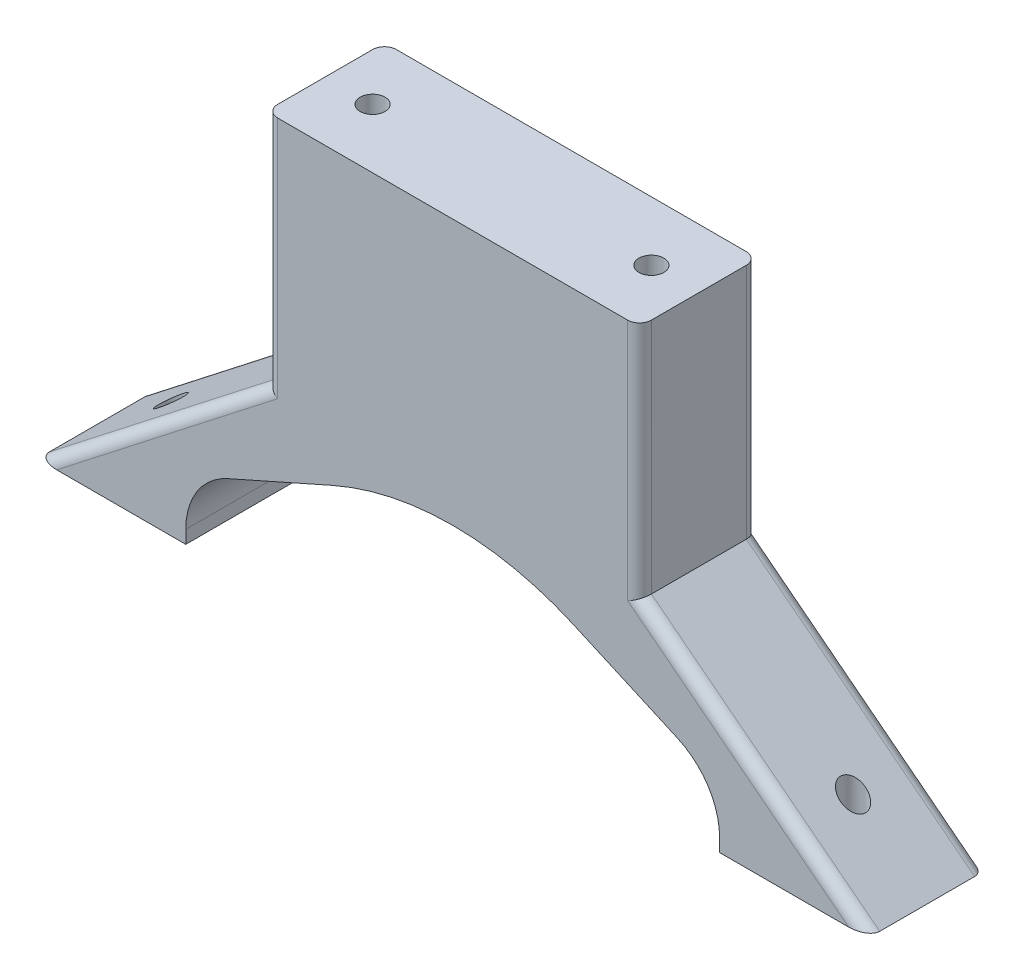
ISO-10303-21;
HEADER;
FILE_DESCRIPTION(('STEP AP214'),'2;1');
FILE_NAME('part.step','',(''),(''),'','','');
FILE_SCHEMA(('AUTOMOTIVE_DESIGN { 1 0 10303 214 1 1 1 1 }'));
ENDSEC;
DATA;
#1=APPLICATION_CONTEXT('core data for automotive mechanical design processes');
#2=APPLICATION_PROTOCOL_DEFINITION('international standard','automotive_design',2000,#1);
#3=PRODUCT_CONTEXT('',#1,'mechanical');
#4=PRODUCT('Part','Part','',(#3));
#5=PRODUCT_RELATED_PRODUCT_CATEGORY('part','',(#4));
#6=PRODUCT_DEFINITION_FORMATION('','',#4);
#7=PRODUCT_DEFINITION_CONTEXT('part definition',#1,'design');
#8=PRODUCT_DEFINITION('design','',#6,#7);
#9=PRODUCT_DEFINITION_SHAPE('','',#8);
#10=(LENGTH_UNIT() NAMED_UNIT(*) SI_UNIT(.MILLI.,.METRE.));
#11=(NAMED_UNIT(*) PLANE_ANGLE_UNIT() SI_UNIT($,.RADIAN.));
#12=(NAMED_UNIT(*) SI_UNIT($,.STERADIAN.) SOLID_ANGLE_UNIT());
#13=UNCERTAINTY_MEASURE_WITH_UNIT(LENGTH_MEASURE(1.E-05),#10,'distance_accuracy_value','');
#14=(GEOMETRIC_REPRESENTATION_CONTEXT(3) GLOBAL_UNCERTAINTY_ASSIGNED_CONTEXT((#13)) GLOBAL_UNIT_ASSIGNED_CONTEXT((#10,
#11,#12)) REPRESENTATION_CONTEXT('',''));
#15=CARTESIAN_POINT('',(0.,0.,0.));
#16=DIRECTION('',(0.,0.,1.));
#17=DIRECTION('',(1.,0.,0.));
#18=AXIS2_PLACEMENT_3D('',#15,#16,#17);
#19=CARTESIAN_POINT('',(0.,0.,-20.));
#20=DIRECTION('',(-1.,0.,0.));
#21=DIRECTION('',(0.,-1.,0.));
#22=AXIS2_PLACEMENT_3D('',#19,#20,#21);
#23=PLANE('',#22);
#24=DIRECTION('',(0.,0.,1.));
#25=VECTOR('',#24,1.);
#26=CARTESIAN_POINT('',(0.,-3.53209388071521,-20.));
#27=LINE('',#26,#25);
#28=CARTESIAN_POINT('',(0.,-3.53209388071521,-18.));
#29=VERTEX_POINT('',#28);
#30=CARTESIAN_POINT('',(0.,-3.53209388071521,-2.));
#31=VERTEX_POINT('',#30);
#32=EDGE_CURVE('E232',#29,#31,#27,.T.);
#33=ORIENTED_EDGE('',*,*,#32,.F.);
#34=DIRECTION('',(0.,-1.,0.));
#35=VECTOR('',#34,1.);
#36=CARTESIAN_POINT('',(0.,-43.5320938807152,-18.));
#37=LINE('',#36,#35);
#38=CARTESIAN_POINT('',(0.,-43.5320938807152,-18.));
#39=VERTEX_POINT('',#38);
#40=EDGE_CURVE('E305',#29,#39,#37,.T.);
#41=ORIENTED_EDGE('',*,*,#40,.T.);
#42=DIRECTION('',(0.,0.,1.));
#43=VECTOR('',#42,1.);
#44=CARTESIAN_POINT('',(0.,-43.5320938807152,-20.));
#45=LINE('',#44,#43);
#46=CARTESIAN_POINT('',(0.,-43.5320938807152,-2.));
#47=VERTEX_POINT('',#46);
#48=EDGE_CURVE('E213',#39,#47,#45,.T.);
#49=ORIENTED_EDGE('',*,*,#48,.T.);
#50=DIRECTION('',(0.,-1.,0.));
#51=VECTOR('',#50,1.);
#52=CARTESIAN_POINT('',(0.,0.,-2.));
#53=LINE('',#52,#51);
#54=EDGE_CURVE('E303',#47,#31,#53,.F.);
#55=ORIENTED_EDGE('',*,*,#54,.T.);
#56=EDGE_LOOP('',(#33,#41,#49,#55));
#57=FACE_BOUND('',#56,.T.);
#58=ADVANCED_FACE('F35',(#57),#23,.T.);
#59=CARTESIAN_POINT('',(0.,-3.53209388071521,-20.));
#60=DIRECTION('',(0.,-1.,0.));
#61=DIRECTION('',(1.,0.,0.));
#62=AXIS2_PLACEMENT_3D('',#59,#60,#61);
#63=PLANE('',#62);
#64=CARTESIAN_POINT('',(8.,-3.53209388071521,-10.));
#65=DIRECTION('',(0.,1.,0.));
#66=DIRECTION('',(0.,0.,1.));
#67=AXIS2_PLACEMENT_3D('',#64,#65,#66);
#68=CIRCLE('',#67,2.09999999999999);
#69=CARTESIAN_POINT('',(8.,-3.53209388071521,-7.90000000000001));
#70=VERTEX_POINT('',#69);
#71=EDGE_CURVE('E671',#70,#70,#68,.T.);
#72=ORIENTED_EDGE('',*,*,#71,.F.);
#73=EDGE_LOOP('',(#72));
#74=FACE_BOUND('',#73,.T.);
#75=CARTESIAN_POINT('',(55.,-3.53209388071521,-10.));
#76=DIRECTION('',(0.,1.,0.));
#77=DIRECTION('',(0.,0.,1.));
#78=AXIS2_PLACEMENT_3D('',#75,#76,#77);
#79=CIRCLE('',#78,2.09999999999998);
#80=CARTESIAN_POINT('',(55.,-3.53209388071521,-7.90000000000002));
#81=VERTEX_POINT('',#80);
#82=EDGE_CURVE('E665',#81,#81,#79,.T.);
#83=ORIENTED_EDGE('',*,*,#82,.F.);
#84=EDGE_LOOP('',(#83));
#85=FACE_BOUND('',#84,.T.);
#86=DIRECTION('',(0.,0.,1.));
#87=VECTOR('',#86,1.);
#88=CARTESIAN_POINT('',(63.,-3.53209388071522,-20.));
#89=LINE('',#88,#87);
#90=CARTESIAN_POINT('',(63.,-3.53209388071522,-18.));
#91=VERTEX_POINT('',#90);
#92=CARTESIAN_POINT('',(63.,-3.53209388071522,-2.));
#93=VERTEX_POINT('',#92);
#94=EDGE_CURVE('E236',#91,#93,#89,.T.);
#95=ORIENTED_EDGE('',*,*,#94,.F.);
#96=CARTESIAN_POINT('',(61.,-3.53209388071522,-18.));
#97=DIRECTION('',(0.,-1.,0.));
#98=DIRECTION('',(1.,0.,0.));
#99=AXIS2_PLACEMENT_3D('',#96,#97,#98);
#100=CIRCLE('',#99,2.);
#101=CARTESIAN_POINT('',(61.,-3.53209388071522,-20.));
#102=VERTEX_POINT('',#101);
#103=EDGE_CURVE('E301',#91,#102,#100,.F.);
#104=ORIENTED_EDGE('',*,*,#103,.T.);
#105=DIRECTION('',(1.,0.,0.));
#106=VECTOR('',#105,1.);
#107=CARTESIAN_POINT('',(0.,-3.53209388071521,-20.));
#108=LINE('',#107,#106);
#109=CARTESIAN_POINT('',(2.,-3.53209388071521,-20.));
#110=VERTEX_POINT('',#109);
#111=EDGE_CURVE('E210',#110,#102,#108,.T.);
#112=ORIENTED_EDGE('',*,*,#111,.F.);
#113=CARTESIAN_POINT('',(2.,-3.53209388071521,-18.));
#114=DIRECTION('',(0.,-1.,0.));
#115=DIRECTION('',(1.,0.,0.));
#116=AXIS2_PLACEMENT_3D('',#113,#114,#115);
#117=CIRCLE('',#116,2.);
#118=EDGE_CURVE('E297',#110,#29,#117,.F.);
#119=ORIENTED_EDGE('',*,*,#118,.T.);
#120=ORIENTED_EDGE('',*,*,#32,.T.);
#121=CARTESIAN_POINT('',(2.,-3.53209388071521,-2.));
#122=DIRECTION('',(0.,-1.,0.));
#123=DIRECTION('',(1.,0.,0.));
#124=AXIS2_PLACEMENT_3D('',#121,#122,#123);
#125=CIRCLE('',#124,2.);
#126=CARTESIAN_POINT('',(2.,-3.53209388071521,0.));
#127=VERTEX_POINT('',#126);
#128=EDGE_CURVE('E295',#31,#127,#125,.F.);
#129=ORIENTED_EDGE('',*,*,#128,.T.);
#130=DIRECTION('',(1.,0.,0.));
#131=VECTOR('',#130,1.);
#132=CARTESIAN_POINT('',(0.,-3.53209388071521,0.));
#133=LINE('',#132,#131);
#134=CARTESIAN_POINT('',(61.,-3.53209388071522,0.));
#135=VERTEX_POINT('',#134);
#136=EDGE_CURVE('E182',#127,#135,#133,.T.);
#137=ORIENTED_EDGE('',*,*,#136,.T.);
#138=CARTESIAN_POINT('',(61.,-3.53209388071522,-2.));
#139=DIRECTION('',(0.,-1.,0.));
#140=DIRECTION('',(1.,0.,0.));
#141=AXIS2_PLACEMENT_3D('',#138,#139,#140);
#142=CIRCLE('',#141,2.);
#143=EDGE_CURVE('E299',#135,#93,#142,.F.);
#144=ORIENTED_EDGE('',*,*,#143,.T.);
#145=EDGE_LOOP('',(#95,#104,#112,#119,#120,#129,#137,#144));
#146=FACE_BOUND('',#145,.T.);
#147=ADVANCED_FACE('F368',(#74,#85,#146),#63,.F.);
#148=CARTESIAN_POINT('',(63.,0.,-20.));
#149=DIRECTION('',(-1.,0.,0.));
#150=DIRECTION('',(0.,0.,1.));
#151=AXIS2_PLACEMENT_3D('',#148,#149,#150);
#152=PLANE('',#151);
#153=DIRECTION('',(0.,0.,1.));
#154=VECTOR('',#153,1.);
#155=CARTESIAN_POINT('',(63.,-43.5320938807152,-20.));
#156=LINE('',#155,#154);
#157=CARTESIAN_POINT('',(63.,-43.5320938807152,-18.));
#158=VERTEX_POINT('',#157);
#159=CARTESIAN_POINT('',(63.,-43.5320938807152,-2.));
#160=VERTEX_POINT('',#159);
#161=EDGE_CURVE('E239',#158,#160,#156,.T.);
#162=ORIENTED_EDGE('',*,*,#161,.F.);
#163=DIRECTION('',(0.,-1.,0.));
#164=VECTOR('',#163,1.);
#165=CARTESIAN_POINT('',(63.,0.,-18.));
#166=LINE('',#165,#164);
#167=EDGE_CURVE('E293',#158,#91,#166,.F.);
#168=ORIENTED_EDGE('',*,*,#167,.T.);
#169=ORIENTED_EDGE('',*,*,#94,.T.);
#170=DIRECTION('',(0.,-1.,0.));
#171=VECTOR('',#170,1.);
#172=CARTESIAN_POINT('',(63.,-43.5320938807152,-2.));
#173=LINE('',#172,#171);
#174=EDGE_CURVE('E291',#93,#160,#173,.T.);
#175=ORIENTED_EDGE('',*,*,#174,.T.);
#176=EDGE_LOOP('',(#162,#168,#169,#175));
#177=FACE_BOUND('',#176,.T.);
#178=ADVANCED_FACE('F401',(#177),#152,.F.);
#179=CARTESIAN_POINT('',(2.69511242219498,3.45872760848355,-20.));
#180=DIRECTION('',(-0.614649576762478,-0.788800290178513,0.));
#181=DIRECTION('',(0.788800290178513,-0.614649576762478,0.));
#182=AXIS2_PLACEMENT_3D('',#179,#180,#181);
#183=PLANE('',#182);
#184=CARTESIAN_POINT('',(89.0000000000036,-63.7918341404582,-10.));
#185=DIRECTION('',(-0.614649576762478,-0.788800290178513,0.));
#186=DIRECTION('',(0.788800290178513,-0.614649576762478,0.));
#187=AXIS2_PLACEMENT_3D('',#184,#185,#186);
#188=ELLIPSE('',#187,2.66227082589529,2.1);
#189=CARTESIAN_POINT('',(91.1000000000035,-65.4281977768219,-10.));
#190=VERTEX_POINT('',#189);
#191=EDGE_CURVE('E216',#190,#190,#188,.T.);
#192=ORIENTED_EDGE('',*,*,#191,.T.);
#193=EDGE_LOOP('',(#192));
#194=FACE_BOUND('',#193,.T.);
#195=DIRECTION('',(0.,0.,1.));
#196=VECTOR('',#195,1.);
#197=CARTESIAN_POINT('',(101.5,-73.5320938807152,-20.));
#198=LINE('',#197,#196);
#199=CARTESIAN_POINT('',(101.5,-73.5320938807152,-18.));
#200=VERTEX_POINT('',#199);
#201=CARTESIAN_POINT('',(101.5,-73.5320938807152,-2.));
#202=VERTEX_POINT('',#201);
#203=EDGE_CURVE('E242',#200,#202,#198,.T.);
#204=ORIENTED_EDGE('',*,*,#203,.F.);
#205=DIRECTION('',(0.788800290178513,-0.614649576762478,0.));
#206=VECTOR('',#205,1.);
#207=CARTESIAN_POINT('',(2.69511242219498,3.45872760848355,-18.));
#208=LINE('',#207,#206);
#209=EDGE_CURVE('E272',#200,#158,#208,.F.);
#210=ORIENTED_EDGE('',*,*,#209,.T.);
#211=ORIENTED_EDGE('',*,*,#161,.T.);
#212=DIRECTION('',(0.788800290178513,-0.614649576762478,0.));
#213=VECTOR('',#212,1.);
#214=CARTESIAN_POINT('',(101.5,-73.5320938807152,-2.));
#215=LINE('',#214,#213);
#216=EDGE_CURVE('E269',#160,#202,#215,.T.);
#217=ORIENTED_EDGE('',*,*,#216,.T.);
#218=EDGE_LOOP('',(#204,#210,#211,#217));
#219=FACE_BOUND('',#218,.T.);
#220=ADVANCED_FACE('F606',(#194,#219),#183,.F.);
#221=CARTESIAN_POINT('',(0.,-73.5320938807151,-20.));
#222=DIRECTION('',(0.,1.,0.));
#223=DIRECTION('',(-1.,0.,0.));
#224=AXIS2_PLACEMENT_3D('',#221,#222,#223);
#225=PLANE('',#224);
#226=CARTESIAN_POINT('',(89.0000000000036,-73.5320938807152,-10.));
#227=DIRECTION('',(0.,-1.,0.));
#228=DIRECTION('',(0.,0.,-1.));
#229=AXIS2_PLACEMENT_3D('',#226,#227,#228);
#230=CIRCLE('',#229,2.1);
#231=CARTESIAN_POINT('',(89.0000000000036,-73.5320938807152,-12.1));
#232=VERTEX_POINT('',#231);
#233=EDGE_CURVE('E654',#232,#232,#230,.T.);
#234=ORIENTED_EDGE('',*,*,#233,.F.);
#235=EDGE_LOOP('',(#234));
#236=FACE_BOUND('',#235,.T.);
#237=DIRECTION('',(-1.,0.,0.));
#238=VECTOR('',#237,1.);
#239=CARTESIAN_POINT('',(0.,-73.5320938807151,-20.));
#240=LINE('',#239,#238);
#241=CARTESIAN_POINT('',(98.2461134350169,-73.5320938807152,-20.));
#242=VERTEX_POINT('',#241);
#243=CARTESIAN_POINT('',(76.5,-73.5320938807152,-20.));
#244=VERTEX_POINT('',#243);
#245=EDGE_CURVE('E208',#242,#244,#240,.T.);
#246=ORIENTED_EDGE('',*,*,#245,.F.);
#247=CARTESIAN_POINT('',(98.2461134350169,-73.5320938807152,-18.));
#248=DIRECTION('',(0.,1.,0.));
#249=DIRECTION('',(1.,0.,0.));
#250=AXIS2_PLACEMENT_3D('',#247,#248,#249);
#251=ELLIPSE('',#250,3.25388656498314,2.);
#252=EDGE_CURVE('E267',#242,#200,#251,.F.);
#253=ORIENTED_EDGE('',*,*,#252,.T.);
#254=ORIENTED_EDGE('',*,*,#203,.T.);
#255=CARTESIAN_POINT('',(98.2461134350169,-73.5320938807152,-2.));
#256=DIRECTION('',(0.,1.,0.));
#257=DIRECTION('',(-1.,0.,0.));
#258=AXIS2_PLACEMENT_3D('',#255,#256,#257);
#259=ELLIPSE('',#258,3.25388656498314,2.);
#260=CARTESIAN_POINT('',(98.2461134350169,-73.5320938807152,0.));
#261=VERTEX_POINT('',#260);
#262=EDGE_CURVE('E265',#202,#261,#259,.F.);
#263=ORIENTED_EDGE('',*,*,#262,.T.);
#264=DIRECTION('',(-1.,0.,0.));
#265=VECTOR('',#264,1.);
#266=CARTESIAN_POINT('',(0.,-73.5320938807151,0.));
#267=LINE('',#266,#265);
#268=CARTESIAN_POINT('',(76.5,-73.5320938807152,0.));
#269=VERTEX_POINT('',#268);
#270=EDGE_CURVE('E228',#261,#269,#267,.T.);
#271=ORIENTED_EDGE('',*,*,#270,.T.);
#272=DIRECTION('',(0.,0.,1.));
#273=VECTOR('',#272,1.);
#274=CARTESIAN_POINT('',(76.5,-73.5320938807152,-20.));
#275=LINE('',#274,#273);
#276=EDGE_CURVE('E245',#244,#269,#275,.T.);
#277=ORIENTED_EDGE('',*,*,#276,.F.);
#278=EDGE_LOOP('',(#246,#253,#254,#263,#271,#277));
#279=FACE_BOUND('',#278,.T.);
#280=ADVANCED_FACE('F353',(#236,#279),#225,.F.);
#281=CARTESIAN_POINT('',(76.5,0.,-20.));
#282=DIRECTION('',(1.,0.,0.));
#283=DIRECTION('',(0.,0.,-1.));
#284=AXIS2_PLACEMENT_3D('',#281,#282,#283);
#285=PLANE('',#284);
#286=DIRECTION('',(0.,1.,0.));
#287=VECTOR('',#286,1.);
#288=CARTESIAN_POINT('',(76.5,0.,0.));
#289=LINE('',#288,#287);
#290=CARTESIAN_POINT('',(76.5,-71.3267766383689,0.));
#291=VERTEX_POINT('',#290);
#292=EDGE_CURVE('E225',#269,#291,#289,.T.);
#293=ORIENTED_EDGE('',*,*,#292,.T.);
#294=DIRECTION('',(0.,0.,1.));
#295=VECTOR('',#294,1.);
#296=CARTESIAN_POINT('',(76.5,-71.3267766383689,-20.));
#297=LINE('',#296,#295);
#298=CARTESIAN_POINT('',(76.5,-71.3267766383689,-20.));
#299=VERTEX_POINT('',#298);
#300=EDGE_CURVE('E324',#291,#299,#297,.F.);
#301=ORIENTED_EDGE('',*,*,#300,.T.);
#302=DIRECTION('',(0.,1.,0.));
#303=VECTOR('',#302,1.);
#304=CARTESIAN_POINT('',(76.5,0.,-20.));
#305=LINE('',#304,#303);
#306=EDGE_CURVE('E205',#244,#299,#305,.T.);
#307=ORIENTED_EDGE('',*,*,#306,.F.);
#308=ORIENTED_EDGE('',*,*,#276,.T.);
#309=EDGE_LOOP('',(#293,#301,#307,#308));
#310=FACE_BOUND('',#309,.T.);
#311=ADVANCED_FACE('F349',(#310),#285,.F.);
#312=CARTESIAN_POINT('',(-10.9540262481049,-24.6170582571376,-20.));
#313=DIRECTION('',(0.406544774887309,0.913630858723493,0.));
#314=DIRECTION('',(-0.913630858723493,0.406544774887309,0.));
#315=AXIS2_PLACEMENT_3D('',#312,#313,#314);
#316=PLANE('',#315);
#317=CARTESIAN_POINT('',(55.,-53.9650870566578,-10.));
#318=DIRECTION('',(0.406544774887309,0.913630858723493,0.));
#319=DIRECTION('',(-0.913630858723493,0.406544774887309,0.));
#320=AXIS2_PLACEMENT_3D('',#317,#318,#319);
#321=ELLIPSE('',#320,2.29852131191591,2.09999999999998);
#322=CARTESIAN_POINT('',(52.9,-53.0306352273312,-10.));
#323=VERTEX_POINT('',#322);
#324=EDGE_CURVE('E321',#323,#323,#321,.T.);
#325=ORIENTED_EDGE('',*,*,#324,.T.);
#326=EDGE_LOOP('',(#325));
#327=FACE_BOUND('',#326,.T.);
#328=DIRECTION('',(-0.913630858723493,0.406544774887309,0.));
#329=VECTOR('',#328,1.);
#330=CARTESIAN_POINT('',(-10.9540262481049,-24.6170582571376,-20.));
#331=LINE('',#330,#329);
#332=CARTESIAN_POINT('',(69.3785372986477,-60.363206333687,-20.));
#333=VERTEX_POINT('',#332);
#334=CARTESIAN_POINT('',(51.8567951982637,-52.5664330200242,-20.));
#335=VERTEX_POINT('',#334);
#336=EDGE_CURVE('E203',#333,#335,#331,.T.);
#337=ORIENTED_EDGE('',*,*,#336,.F.);
#338=DIRECTION('',(0.,0.,1.));
#339=VECTOR('',#338,1.);
#340=CARTESIAN_POINT('',(69.3785372986477,-60.3632063336869,0.));
#341=LINE('',#340,#339);
#342=CARTESIAN_POINT('',(69.3785372986477,-60.363206333687,0.));
#343=VERTEX_POINT('',#342);
#344=EDGE_CURVE('E307',#333,#343,#341,.T.);
#345=ORIENTED_EDGE('',*,*,#344,.T.);
#346=DIRECTION('',(-0.913630858723493,0.406544774887309,0.));
#347=VECTOR('',#346,1.);
#348=CARTESIAN_POINT('',(-10.9540262481049,-24.6170582571376,0.));
#349=LINE('',#348,#347);
#350=CARTESIAN_POINT('',(51.8567951982637,-52.5664330200242,0.));
#351=VERTEX_POINT('',#350);
#352=EDGE_CURVE('E223',#343,#351,#349,.T.);
#353=ORIENTED_EDGE('',*,*,#352,.T.);
#354=DIRECTION('',(0.,0.,1.));
#355=VECTOR('',#354,1.);
#356=CARTESIAN_POINT('',(51.8567951982637,-52.5664330200242,-20.));
#357=LINE('',#356,#355);
#358=EDGE_CURVE('E248',#335,#351,#357,.T.);
#359=ORIENTED_EDGE('',*,*,#358,.F.);
#360=EDGE_LOOP('',(#337,#345,#353,#359));
#361=FACE_BOUND('',#360,.T.);
#362=ADVANCED_FACE('F340',(#327,#361),#316,.F.);
#363=CARTESIAN_POINT('',(31.5295564538981,-98.2479759561988,-20.));
#364=DIRECTION('',(0.,0.,1.));
#365=DIRECTION('',(1.,0.,0.));
#366=AXIS2_PLACEMENT_3D('',#363,#364,#365);
#367=CYLINDRICAL_SURFACE('',#366,50.);
#368=CARTESIAN_POINT('',(31.5295564538981,-98.2479759561988,0.));
#369=DIRECTION('',(0.,0.,1.));
#370=DIRECTION('',(1.,0.,0.));
#371=AXIS2_PLACEMENT_3D('',#368,#369,#370);
#372=CIRCLE('',#371,50.);
#373=CARTESIAN_POINT('',(11.2429120255452,-52.5483910802114,0.));
#374=VERTEX_POINT('',#373);
#375=EDGE_CURVE('E220',#351,#374,#372,.T.);
#376=ORIENTED_EDGE('',*,*,#375,.T.);
#377=DIRECTION('',(0.,0.,1.));
#378=VECTOR('',#377,1.);
#379=CARTESIAN_POINT('',(11.2429120255452,-52.5483910802114,-20.));
#380=LINE('',#379,#378);
#381=CARTESIAN_POINT('',(11.2429120255452,-52.5483910802114,-20.));
#382=VERTEX_POINT('',#381);
#383=EDGE_CURVE('E190',#382,#374,#380,.T.);
#384=ORIENTED_EDGE('',*,*,#383,.F.);
#385=CARTESIAN_POINT('',(31.5295564538981,-98.2479759561988,-20.));
#386=DIRECTION('',(0.,0.,1.));
#387=DIRECTION('',(1.,0.,0.));
#388=AXIS2_PLACEMENT_3D('',#385,#386,#387);
#389=CIRCLE('',#388,50.);
#390=EDGE_CURVE('E197',#335,#382,#389,.T.);
#391=ORIENTED_EDGE('',*,*,#390,.F.);
#392=ORIENTED_EDGE('',*,*,#358,.T.);
#393=EDGE_LOOP('',(#376,#384,#391,#392));
#394=FACE_BOUND('',#393,.T.);
#395=ADVANCED_FACE('F499',(#394),#367,.F.);
#396=CARTESIAN_POINT('',(21.337659908571,-48.0672002454908,-20.));
#397=DIRECTION('',(0.405732888567054,-0.91399169751975,0.));
#398=DIRECTION('',(0.91399169751975,0.405732888567054,0.));
#399=AXIS2_PLACEMENT_3D('',#396,#397,#398);
#400=PLANE('',#399);
#401=CARTESIAN_POINT('',(8.,-53.9879622131481,-10.));
#402=DIRECTION('',(0.405732888567054,-0.91399169751975,0.));
#403=DIRECTION('',(0.91399169751975,0.405732888567054,0.));
#404=AXIS2_PLACEMENT_3D('',#401,#402,#403);
#405=ELLIPSE('',#404,2.29761386859273,2.09999999999999);
#406=CARTESIAN_POINT('',(10.1,-53.0557447014323,-10.));
#407=VERTEX_POINT('',#406);
#408=EDGE_CURVE('E668',#407,#407,#405,.T.);
#409=ORIENTED_EDGE('',*,*,#408,.F.);
#410=EDGE_LOOP('',(#409));
#411=FACE_BOUND('',#410,.T.);
#412=DIRECTION('',(0.91399169751975,0.405732888567054,0.));
#413=VECTOR('',#412,1.);
#414=CARTESIAN_POINT('',(21.337659908571,-48.0672002454908,0.));
#415=LINE('',#414,#413);
#416=CARTESIAN_POINT('',(-6.36879466280466,-60.3664584069176,0.));
#417=VERTEX_POINT('',#416);
#418=EDGE_CURVE('E218',#417,#374,#415,.T.);
#419=ORIENTED_EDGE('',*,*,#418,.F.);
#420=DIRECTION('',(0.,0.,1.));
#421=VECTOR('',#420,1.);
#422=CARTESIAN_POINT('',(-6.36879466280465,-60.3664584069176,-20.));
#423=LINE('',#422,#421);
#424=CARTESIAN_POINT('',(-6.36879466280466,-60.3664584069176,-20.));
#425=VERTEX_POINT('',#424);
#426=EDGE_CURVE('E50',#417,#425,#423,.F.);
#427=ORIENTED_EDGE('',*,*,#426,.T.);
#428=DIRECTION('',(0.91399169751975,0.405732888567054,0.));
#429=VECTOR('',#428,1.);
#430=CARTESIAN_POINT('',(21.337659908571,-48.0672002454908,-20.));
#431=LINE('',#430,#429);
#432=EDGE_CURVE('E195',#425,#382,#431,.T.);
#433=ORIENTED_EDGE('',*,*,#432,.T.);
#434=ORIENTED_EDGE('',*,*,#383,.T.);
#435=EDGE_LOOP('',(#419,#427,#433,#434));
#436=FACE_BOUND('',#435,.T.);
#437=ADVANCED_FACE('F507',(#411,#436),#400,.T.);
#438=CARTESIAN_POINT('',(-13.5,0.,-20.));
#439=DIRECTION('',(1.,0.,0.));
#440=DIRECTION('',(0.,0.,-1.));
#441=AXIS2_PLACEMENT_3D('',#438,#439,#440);
#442=PLANE('',#441);
#443=DIRECTION('',(0.,1.,0.));
#444=VECTOR('',#443,1.);
#445=CARTESIAN_POINT('',(-13.5,0.,-20.));
#446=LINE('',#445,#444);
#447=CARTESIAN_POINT('',(-13.5,-73.5320938807152,-20.));
#448=VERTEX_POINT('',#447);
#449=CARTESIAN_POINT('',(-13.5,-71.3343587771545,-20.));
#450=VERTEX_POINT('',#449);
#451=EDGE_CURVE('E181',#448,#450,#446,.T.);
#452=ORIENTED_EDGE('',*,*,#451,.T.);
#453=DIRECTION('',(0.,0.,1.));
#454=VECTOR('',#453,1.);
#455=CARTESIAN_POINT('',(-13.5,-71.3343587771545,0.));
#456=LINE('',#455,#454);
#457=CARTESIAN_POINT('',(-13.5,-71.3343587771545,0.));
#458=VERTEX_POINT('',#457);
#459=EDGE_CURVE('E326',#450,#458,#456,.T.);
#460=ORIENTED_EDGE('',*,*,#459,.T.);
#461=DIRECTION('',(0.,1.,0.));
#462=VECTOR('',#461,1.);
#463=CARTESIAN_POINT('',(-13.5,0.,0.));
#464=LINE('',#463,#462);
#465=CARTESIAN_POINT('',(-13.5,-73.5320938807152,0.));
#466=VERTEX_POINT('',#465);
#467=EDGE_CURVE('E189',#466,#458,#464,.T.);
#468=ORIENTED_EDGE('',*,*,#467,.F.);
#469=DIRECTION('',(0.,0.,1.));
#470=VECTOR('',#469,1.);
#471=CARTESIAN_POINT('',(-13.5,-73.5320938807152,-20.));
#472=LINE('',#471,#470);
#473=EDGE_CURVE('E174',#448,#466,#472,.T.);
#474=ORIENTED_EDGE('',*,*,#473,.F.);
#475=EDGE_LOOP('',(#452,#460,#468,#474));
#476=FACE_BOUND('',#475,.T.);
#477=ADVANCED_FACE('F186',(#476),#442,.T.);
#478=CARTESIAN_POINT('',(0.,-73.5320938807152,-20.));
#479=DIRECTION('',(0.,-1.,0.));
#480=DIRECTION('',(1.,0.,0.));
#481=AXIS2_PLACEMENT_3D('',#478,#479,#480);
#482=PLANE('',#481);
#483=CARTESIAN_POINT('',(-25.9999999999965,-73.5320938807152,-10.));
#484=DIRECTION('',(0.,-1.,0.));
#485=DIRECTION('',(0.,0.,-1.));
#486=AXIS2_PLACEMENT_3D('',#483,#484,#485);
#487=CIRCLE('',#486,2.1);
#488=CARTESIAN_POINT('',(-25.9999999999965,-73.5320938807152,-12.1));
#489=VERTEX_POINT('',#488);
#490=EDGE_CURVE('E311',#489,#489,#487,.T.);
#491=ORIENTED_EDGE('',*,*,#490,.F.);
#492=EDGE_LOOP('',(#491));
#493=FACE_BOUND('',#492,.T.);
#494=DIRECTION('',(1.,0.,0.));
#495=VECTOR('',#494,1.);
#496=CARTESIAN_POINT('',(0.,-73.5320938807152,0.));
#497=LINE('',#496,#495);
#498=CARTESIAN_POINT('',(-35.2461134350169,-73.5320938807152,0.));
#499=VERTEX_POINT('',#498);
#500=EDGE_CURVE('E214',#499,#466,#497,.T.);
#501=ORIENTED_EDGE('',*,*,#500,.F.);
#502=CARTESIAN_POINT('',(-35.2461134350169,-73.5320938807152,-2.));
#503=DIRECTION('',(0.,-1.,0.));
#504=DIRECTION('',(-1.,0.,0.));
#505=AXIS2_PLACEMENT_3D('',#502,#503,#504);
#506=ELLIPSE('',#505,3.25388656498314,2.);
#507=CARTESIAN_POINT('',(-38.5,-73.5320938807152,-2.));
#508=VERTEX_POINT('',#507);
#509=EDGE_CURVE('E284',#499,#508,#506,.T.);
#510=ORIENTED_EDGE('',*,*,#509,.T.);
#511=DIRECTION('',(0.,0.,1.));
#512=VECTOR('',#511,1.);
#513=CARTESIAN_POINT('',(-38.5,-73.5320938807152,-20.));
#514=LINE('',#513,#512);
#515=CARTESIAN_POINT('',(-38.5,-73.5320938807152,-18.));
#516=VERTEX_POINT('',#515);
#517=EDGE_CURVE('E191',#516,#508,#514,.T.);
#518=ORIENTED_EDGE('',*,*,#517,.F.);
#519=CARTESIAN_POINT('',(-35.2461134350169,-73.5320938807152,-18.));
#520=DIRECTION('',(0.,-1.,0.));
#521=DIRECTION('',(1.,0.,0.));
#522=AXIS2_PLACEMENT_3D('',#519,#520,#521);
#523=ELLIPSE('',#522,3.25388656498314,2.);
#524=CARTESIAN_POINT('',(-35.2461134350169,-73.5320938807152,-20.));
#525=VERTEX_POINT('',#524);
#526=EDGE_CURVE('E177',#516,#525,#523,.T.);
#527=ORIENTED_EDGE('',*,*,#526,.T.);
#528=DIRECTION('',(1.,0.,0.));
#529=VECTOR('',#528,1.);
#530=CARTESIAN_POINT('',(0.,-73.5320938807152,-20.));
#531=LINE('',#530,#529);
#532=EDGE_CURVE('E170',#525,#448,#531,.T.);
#533=ORIENTED_EDGE('',*,*,#532,.T.);
#534=ORIENTED_EDGE('',*,*,#473,.T.);
#535=EDGE_LOOP('',(#501,#510,#518,#527,#533,#534));
#536=FACE_BOUND('',#535,.T.);
#537=ADVANCED_FACE('F173',(#493,#536),#482,.T.);
#538=CARTESIAN_POINT('',(21.1059160173055,-27.0859255555421,-20.));
#539=DIRECTION('',(-0.614649576762478,0.788800290178513,0.));
#540=DIRECTION('',(-0.788800290178513,-0.614649576762478,0.));
#541=AXIS2_PLACEMENT_3D('',#538,#539,#540);
#542=PLANE('',#541);
#543=CARTESIAN_POINT('',(-25.9999999999965,-63.7918341404527,-10.));
#544=DIRECTION('',(-0.614649576762478,0.788800290178513,0.));
#545=DIRECTION('',(-0.788800290178513,-0.614649576762478,0.));
#546=AXIS2_PLACEMENT_3D('',#543,#544,#545);
#547=ELLIPSE('',#546,2.66227082589529,2.09999999999999);
#548=CARTESIAN_POINT('',(-28.0999999999965,-65.4281977768164,-10.));
#549=VERTEX_POINT('',#548);
#550=EDGE_CURVE('E656',#549,#549,#547,.T.);
#551=ORIENTED_EDGE('',*,*,#550,.F.);
#552=EDGE_LOOP('',(#551));
#553=FACE_BOUND('',#552,.T.);
#554=ORIENTED_EDGE('',*,*,#517,.T.);
#555=DIRECTION('',(-0.788800290178513,-0.614649576762478,0.));
#556=VECTOR('',#555,1.);
#557=CARTESIAN_POINT('',(21.1059160173055,-27.0859255555421,-2.));
#558=LINE('',#557,#556);
#559=EDGE_CURVE('E289',#508,#47,#558,.F.);
#560=ORIENTED_EDGE('',*,*,#559,.T.);
#561=ORIENTED_EDGE('',*,*,#48,.F.);
#562=DIRECTION('',(-0.788800290178513,-0.614649576762478,0.));
#563=VECTOR('',#562,1.);
#564=CARTESIAN_POINT('',(-38.5,-73.5320938807152,-18.));
#565=LINE('',#564,#563);
#566=EDGE_CURVE('E286',#39,#516,#565,.T.);
#567=ORIENTED_EDGE('',*,*,#566,.T.);
#568=EDGE_LOOP('',(#554,#560,#561,#567));
#569=FACE_BOUND('',#568,.T.);
#570=ADVANCED_FACE('F379',(#553,#569),#542,.T.);
#571=CARTESIAN_POINT('',(0.,0.,-20.));
#572=DIRECTION('',(0.,0.,1.));
#573=DIRECTION('',(1.,0.,0.));
#574=AXIS2_PLACEMENT_3D('',#571,#572,#573);
#575=PLANE('',#574);
#576=DIRECTION('',(0.,-1.,0.));
#577=VECTOR('',#576,1.);
#578=CARTESIAN_POINT('',(61.,0.,-20.));
#579=LINE('',#578,#577);
#580=CARTESIAN_POINT('',(61.,-44.5091483469358,-20.));
#581=VERTEX_POINT('',#580);
#582=EDGE_CURVE('E260',#102,#581,#579,.T.);
#583=ORIENTED_EDGE('',*,*,#582,.T.);
#584=DIRECTION('',(0.788800290178513,-0.614649576762478,0.));
#585=VECTOR('',#584,1.);
#586=CARTESIAN_POINT('',(1.46581326867002,1.88112702812653,-20.));
#587=LINE('',#586,#585);
#588=EDGE_CURVE('E262',#581,#242,#587,.T.);
#589=ORIENTED_EDGE('',*,*,#588,.T.);
#590=ORIENTED_EDGE('',*,*,#245,.T.);
#591=ORIENTED_EDGE('',*,*,#306,.T.);
#592=CARTESIAN_POINT('',(64.5,-71.3267766383689,-20.));
#593=DIRECTION('',(0.,0.,1.));
#594=DIRECTION('',(1.,0.,0.));
#595=AXIS2_PLACEMENT_3D('',#592,#593,#594);
#596=CIRCLE('',#595,12.);
#597=EDGE_CURVE('E331',#299,#333,#596,.T.);
#598=ORIENTED_EDGE('',*,*,#597,.T.);
#599=ORIENTED_EDGE('',*,*,#336,.T.);
#600=ORIENTED_EDGE('',*,*,#390,.T.);
#601=ORIENTED_EDGE('',*,*,#432,.F.);
#602=CARTESIAN_POINT('',(-1.50000000000001,-71.3343587771545,-20.));
#603=DIRECTION('',(0.,0.,1.));
#604=DIRECTION('',(1.,0.,0.));
#605=AXIS2_PLACEMENT_3D('',#602,#603,#604);
#606=CIRCLE('',#605,12.);
#607=EDGE_CURVE('E11',#425,#450,#606,.T.);
#608=ORIENTED_EDGE('',*,*,#607,.T.);
#609=ORIENTED_EDGE('',*,*,#451,.F.);
#610=ORIENTED_EDGE('',*,*,#532,.F.);
#611=DIRECTION('',(-0.788800290178513,-0.614649576762478,0.));
#612=VECTOR('',#611,1.);
#613=CARTESIAN_POINT('',(1.22929915352495,-45.1096944610722,-20.));
#614=LINE('',#613,#612);
#615=CARTESIAN_POINT('',(2.,-44.5091483469358,-20.));
#616=VERTEX_POINT('',#615);
#617=EDGE_CURVE('E258',#525,#616,#614,.F.);
#618=ORIENTED_EDGE('',*,*,#617,.T.);
#619=DIRECTION('',(0.,-1.,0.));
#620=VECTOR('',#619,1.);
#621=CARTESIAN_POINT('',(2.,-3.53209388071521,-20.));
#622=LINE('',#621,#620);
#623=EDGE_CURVE('E235',#616,#110,#622,.F.);
#624=ORIENTED_EDGE('',*,*,#623,.T.);
#625=ORIENTED_EDGE('',*,*,#111,.T.);
#626=EDGE_LOOP('',(#583,#589,#590,#591,#598,#599,#600,#601,#608,#609,#610,#618,#624,#625));
#627=FACE_BOUND('',#626,.T.);
#628=ADVANCED_FACE('F193',(#627),#575,.F.);
#629=CARTESIAN_POINT('',(0.,0.,0.));
#630=DIRECTION('',(0.,0.,1.));
#631=DIRECTION('',(1.,0.,0.));
#632=AXIS2_PLACEMENT_3D('',#629,#630,#631);
#633=PLANE('',#632);
#634=ORIENTED_EDGE('',*,*,#270,.F.);
#635=DIRECTION('',(0.788800290178513,-0.614649576762478,0.));
#636=VECTOR('',#635,1.);
#637=CARTESIAN_POINT('',(61.7707008464751,-45.1096944610722,0.));
#638=LINE('',#637,#636);
#639=CARTESIAN_POINT('',(61.,-44.5091483469358,0.));
#640=VERTEX_POINT('',#639);
#641=EDGE_CURVE('E281',#261,#640,#638,.F.);
#642=ORIENTED_EDGE('',*,*,#641,.T.);
#643=DIRECTION('',(0.,-1.,0.));
#644=VECTOR('',#643,1.);
#645=CARTESIAN_POINT('',(61.,-3.53209388071522,0.));
#646=LINE('',#645,#644);
#647=EDGE_CURVE('E279',#640,#135,#646,.F.);
#648=ORIENTED_EDGE('',*,*,#647,.T.);
#649=ORIENTED_EDGE('',*,*,#136,.F.);
#650=DIRECTION('',(0.,-1.,0.));
#651=VECTOR('',#650,1.);
#652=CARTESIAN_POINT('',(2.,0.,0.));
#653=LINE('',#652,#651);
#654=CARTESIAN_POINT('',(2.,-44.5091483469358,0.));
#655=VERTEX_POINT('',#654);
#656=EDGE_CURVE('E274',#127,#655,#653,.T.);
#657=ORIENTED_EDGE('',*,*,#656,.T.);
#658=DIRECTION('',(-0.788800290178513,-0.614649576762478,0.));
#659=VECTOR('',#658,1.);
#660=CARTESIAN_POINT('',(22.3352151708305,-28.6635261358991,0.));
#661=LINE('',#660,#659);
#662=EDGE_CURVE('E276',#655,#499,#661,.T.);
#663=ORIENTED_EDGE('',*,*,#662,.T.);
#664=ORIENTED_EDGE('',*,*,#500,.T.);
#665=ORIENTED_EDGE('',*,*,#467,.T.);
#666=CARTESIAN_POINT('',(-1.50000000000001,-71.3343587771545,0.));
#667=DIRECTION('',(0.,0.,1.));
#668=DIRECTION('',(1.,0.,0.));
#669=AXIS2_PLACEMENT_3D('',#666,#667,#668);
#670=CIRCLE('',#669,12.);
#671=EDGE_CURVE('E43',#458,#417,#670,.F.);
#672=ORIENTED_EDGE('',*,*,#671,.T.);
#673=ORIENTED_EDGE('',*,*,#418,.T.);
#674=ORIENTED_EDGE('',*,*,#375,.F.);
#675=ORIENTED_EDGE('',*,*,#352,.F.);
#676=CARTESIAN_POINT('',(64.5,-71.3267766383689,0.));
#677=DIRECTION('',(0.,0.,1.));
#678=DIRECTION('',(1.,0.,0.));
#679=AXIS2_PLACEMENT_3D('',#676,#677,#678);
#680=CIRCLE('',#679,12.);
#681=EDGE_CURVE('E329',#343,#291,#680,.F.);
#682=ORIENTED_EDGE('',*,*,#681,.T.);
#683=ORIENTED_EDGE('',*,*,#292,.F.);
#684=EDGE_LOOP('',(#634,#642,#648,#649,#657,#663,#664,#665,#672,#673,#674,#675,#682,#683));
#685=FACE_BOUND('',#684,.T.);
#686=ADVANCED_FACE('F346',(#685),#633,.T.);
#687=CARTESIAN_POINT('',(89.0000000000036,-73.5320938807152,-10.));
#688=DIRECTION('',(0.,-1.,0.));
#689=DIRECTION('',(0.,0.,-1.));
#690=AXIS2_PLACEMENT_3D('',#687,#688,#689);
#691=CYLINDRICAL_SURFACE('',#690,2.1);
#692=ORIENTED_EDGE('',*,*,#233,.T.);
#693=EDGE_LOOP('',(#692));
#694=FACE_BOUND('',#693,.T.);
#695=ORIENTED_EDGE('',*,*,#191,.F.);
#696=EDGE_LOOP('',(#695));
#697=FACE_BOUND('',#696,.T.);
#698=ADVANCED_FACE('F542',(#694,#697),#691,.F.);
#699=CARTESIAN_POINT('',(-25.9999999999965,-73.5320938807152,-10.));
#700=DIRECTION('',(0.,-1.,0.));
#701=DIRECTION('',(0.,0.,-1.));
#702=AXIS2_PLACEMENT_3D('',#699,#700,#701);
#703=CYLINDRICAL_SURFACE('',#702,2.09999999999999);
#704=ORIENTED_EDGE('',*,*,#550,.T.);
#705=EDGE_LOOP('',(#704));
#706=FACE_BOUND('',#705,.T.);
#707=ORIENTED_EDGE('',*,*,#490,.T.);
#708=EDGE_LOOP('',(#707));
#709=FACE_BOUND('',#708,.T.);
#710=ADVANCED_FACE('F414',(#706,#709),#703,.F.);
#711=CARTESIAN_POINT('',(61.,0.,-18.));
#712=DIRECTION('',(0.,-1.,0.));
#713=DIRECTION('',(0.,0.,-1.));
#714=AXIS2_PLACEMENT_3D('',#711,#712,#713);
#715=CYLINDRICAL_SURFACE('',#714,2.);
#716=ORIENTED_EDGE('',*,*,#103,.F.);
#717=ORIENTED_EDGE('',*,*,#167,.F.);
#718=CARTESIAN_POINT('',(61.,-44.5091483469358,-18.));
#719=DIRECTION('',(0.438947846126121,-0.898512542139084,0.));
#720=DIRECTION('',(0.898512542139084,0.438947846126121,0.));
#721=AXIS2_PLACEMENT_3D('',#718,#719,#720);
#722=ELLIPSE('',#721,2.22590103777362,2.);
#723=EDGE_CURVE('E308',#581,#158,#722,.T.);
#724=ORIENTED_EDGE('',*,*,#723,.F.);
#725=ORIENTED_EDGE('',*,*,#582,.F.);
#726=EDGE_LOOP('',(#716,#717,#724,#725));
#727=FACE_BOUND('',#726,.T.);
#728=ADVANCED_FACE('F410',(#727),#715,.T.);
#729=CARTESIAN_POINT('',(1.46581326867002,1.88112702812652,-18.));
#730=DIRECTION('',(0.788800290178513,-0.614649576762478,0.));
#731=DIRECTION('',(0.614649576762478,0.788800290178513,0.));
#732=AXIS2_PLACEMENT_3D('',#729,#730,#731);
#733=CYLINDRICAL_SURFACE('',#732,2.);
#734=ORIENTED_EDGE('',*,*,#723,.T.);
#735=ORIENTED_EDGE('',*,*,#209,.F.);
#736=ORIENTED_EDGE('',*,*,#252,.F.);
#737=ORIENTED_EDGE('',*,*,#588,.F.);
#738=EDGE_LOOP('',(#734,#735,#736,#737));
#739=FACE_BOUND('',#738,.T.);
#740=ADVANCED_FACE('F407',(#739),#733,.T.);
#741=CARTESIAN_POINT('',(61.,0.,-2.));
#742=DIRECTION('',(0.,1.,0.));
#743=DIRECTION('',(0.,0.,1.));
#744=AXIS2_PLACEMENT_3D('',#741,#742,#743);
#745=CYLINDRICAL_SURFACE('',#744,2.);
#746=ORIENTED_EDGE('',*,*,#143,.F.);
#747=ORIENTED_EDGE('',*,*,#647,.F.);
#748=CARTESIAN_POINT('',(61.,-44.5091483469358,-2.));
#749=DIRECTION('',(-0.438947846126121,0.898512542139084,0.));
#750=DIRECTION('',(-0.898512542139084,-0.438947846126121,0.));
#751=AXIS2_PLACEMENT_3D('',#748,#749,#750);
#752=ELLIPSE('',#751,2.22590103777362,2.);
#753=EDGE_CURVE('E312',#160,#640,#752,.F.);
#754=ORIENTED_EDGE('',*,*,#753,.F.);
#755=ORIENTED_EDGE('',*,*,#174,.F.);
#756=EDGE_LOOP('',(#746,#747,#754,#755));
#757=FACE_BOUND('',#756,.T.);
#758=ADVANCED_FACE('F363',(#757),#745,.T.);
#759=CARTESIAN_POINT('',(1.46581326867002,1.88112702812652,-2.));
#760=DIRECTION('',(-0.788800290178513,0.614649576762478,0.));
#761=DIRECTION('',(-0.614649576762478,-0.788800290178513,0.));
#762=AXIS2_PLACEMENT_3D('',#759,#760,#761);
#763=CYLINDRICAL_SURFACE('',#762,2.);
#764=ORIENTED_EDGE('',*,*,#753,.T.);
#765=ORIENTED_EDGE('',*,*,#641,.F.);
#766=ORIENTED_EDGE('',*,*,#262,.F.);
#767=ORIENTED_EDGE('',*,*,#216,.F.);
#768=EDGE_LOOP('',(#764,#765,#766,#767));
#769=FACE_BOUND('',#768,.T.);
#770=ADVANCED_FACE('F357',(#769),#763,.T.);
#771=CARTESIAN_POINT('',(2.,0.,-2.));
#772=DIRECTION('',(0.,-1.,0.));
#773=DIRECTION('',(1.,0.,0.));
#774=AXIS2_PLACEMENT_3D('',#771,#772,#773);
#775=CYLINDRICAL_SURFACE('',#774,2.);
#776=ORIENTED_EDGE('',*,*,#128,.F.);
#777=ORIENTED_EDGE('',*,*,#54,.F.);
#778=CARTESIAN_POINT('',(2.,-44.5091483469358,-2.));
#779=DIRECTION('',(-0.438947846126121,-0.898512542139084,0.));
#780=DIRECTION('',(-0.898512542139084,0.438947846126121,0.));
#781=AXIS2_PLACEMENT_3D('',#778,#779,#780);
#782=ELLIPSE('',#781,2.22590103777362,2.);
#783=EDGE_CURVE('E315',#655,#47,#782,.T.);
#784=ORIENTED_EDGE('',*,*,#783,.F.);
#785=ORIENTED_EDGE('',*,*,#656,.F.);
#786=EDGE_LOOP('',(#776,#777,#784,#785));
#787=FACE_BOUND('',#786,.T.);
#788=ADVANCED_FACE('F373',(#787),#775,.T.);
#789=CARTESIAN_POINT('',(22.3352151708305,-28.6635261358991,-2.));
#790=DIRECTION('',(-0.788800290178513,-0.614649576762478,0.));
#791=DIRECTION('',(0.614649576762478,-0.788800290178513,0.));
#792=AXIS2_PLACEMENT_3D('',#789,#790,#791);
#793=CYLINDRICAL_SURFACE('',#792,2.);
#794=ORIENTED_EDGE('',*,*,#783,.T.);
#795=ORIENTED_EDGE('',*,*,#559,.F.);
#796=ORIENTED_EDGE('',*,*,#509,.F.);
#797=ORIENTED_EDGE('',*,*,#662,.F.);
#798=EDGE_LOOP('',(#794,#795,#796,#797));
#799=FACE_BOUND('',#798,.T.);
#800=ADVANCED_FACE('F382',(#799),#793,.T.);
#801=CARTESIAN_POINT('',(2.,0.,-18.));
#802=DIRECTION('',(0.,1.,0.));
#803=DIRECTION('',(-1.,0.,0.));
#804=AXIS2_PLACEMENT_3D('',#801,#802,#803);
#805=CYLINDRICAL_SURFACE('',#804,2.);
#806=ORIENTED_EDGE('',*,*,#118,.F.);
#807=ORIENTED_EDGE('',*,*,#623,.F.);
#808=CARTESIAN_POINT('',(2.,-44.5091483469358,-18.));
#809=DIRECTION('',(0.438947846126121,0.898512542139084,0.));
#810=DIRECTION('',(0.898512542139084,-0.438947846126121,0.));
#811=AXIS2_PLACEMENT_3D('',#808,#809,#810);
#812=ELLIPSE('',#811,2.22590103777362,2.);
#813=EDGE_CURVE('E318',#39,#616,#812,.F.);
#814=ORIENTED_EDGE('',*,*,#813,.F.);
#815=ORIENTED_EDGE('',*,*,#40,.F.);
#816=EDGE_LOOP('',(#806,#807,#814,#815));
#817=FACE_BOUND('',#816,.T.);
#818=ADVANCED_FACE('F384',(#817),#805,.T.);
#819=CARTESIAN_POINT('',(22.3352151708305,-28.6635261358991,-18.));
#820=DIRECTION('',(0.788800290178513,0.614649576762478,0.));
#821=DIRECTION('',(-0.614649576762478,0.788800290178513,0.));
#822=AXIS2_PLACEMENT_3D('',#819,#820,#821);
#823=CYLINDRICAL_SURFACE('',#822,2.);
#824=ORIENTED_EDGE('',*,*,#813,.T.);
#825=ORIENTED_EDGE('',*,*,#617,.F.);
#826=ORIENTED_EDGE('',*,*,#526,.F.);
#827=ORIENTED_EDGE('',*,*,#566,.F.);
#828=EDGE_LOOP('',(#824,#825,#826,#827));
#829=FACE_BOUND('',#828,.T.);
#830=ADVANCED_FACE('F390',(#829),#823,.T.);
#831=CARTESIAN_POINT('',(55.,-3.53209388071522,-10.));
#832=DIRECTION('',(0.,1.,0.));
#833=DIRECTION('',(0.,0.,1.));
#834=AXIS2_PLACEMENT_3D('',#831,#832,#833);
#835=CYLINDRICAL_SURFACE('',#834,2.09999999999998);
#836=ORIENTED_EDGE('',*,*,#82,.T.);
#837=EDGE_LOOP('',(#836));
#838=FACE_BOUND('',#837,.T.);
#839=ORIENTED_EDGE('',*,*,#324,.F.);
#840=EDGE_LOOP('',(#839));
#841=FACE_BOUND('',#840,.T.);
#842=ADVANCED_FACE('F449',(#838,#841),#835,.F.);
#843=CARTESIAN_POINT('',(8.,-3.53209388071521,-10.));
#844=DIRECTION('',(0.,1.,0.));
#845=DIRECTION('',(0.,0.,1.));
#846=AXIS2_PLACEMENT_3D('',#843,#844,#845);
#847=CYLINDRICAL_SURFACE('',#846,2.09999999999999);
#848=ORIENTED_EDGE('',*,*,#408,.T.);
#849=EDGE_LOOP('',(#848));
#850=FACE_BOUND('',#849,.T.);
#851=ORIENTED_EDGE('',*,*,#71,.T.);
#852=EDGE_LOOP('',(#851));
#853=FACE_BOUND('',#852,.T.);
#854=ADVANCED_FACE('F468',(#850,#853),#847,.F.);
#855=CARTESIAN_POINT('',(64.5,-71.3267766383689,-20.));
#856=DIRECTION('',(0.,0.,-1.));
#857=DIRECTION('',(-1.,0.,0.));
#858=AXIS2_PLACEMENT_3D('',#855,#856,#857);
#859=CYLINDRICAL_SURFACE('',#858,12.);
#860=ORIENTED_EDGE('',*,*,#597,.F.);
#861=ORIENTED_EDGE('',*,*,#300,.F.);
#862=ORIENTED_EDGE('',*,*,#681,.F.);
#863=ORIENTED_EDGE('',*,*,#344,.F.);
#864=EDGE_LOOP('',(#860,#861,#862,#863));
#865=FACE_BOUND('',#864,.T.);
#866=ADVANCED_FACE('F343',(#865),#859,.F.);
#867=CARTESIAN_POINT('',(-1.50000000000001,-71.3343587771545,-20.));
#868=DIRECTION('',(0.,0.,-1.));
#869=DIRECTION('',(-1.,0.,0.));
#870=AXIS2_PLACEMENT_3D('',#867,#868,#869);
#871=CYLINDRICAL_SURFACE('',#870,12.);
#872=ORIENTED_EDGE('',*,*,#607,.F.);
#873=ORIENTED_EDGE('',*,*,#426,.F.);
#874=ORIENTED_EDGE('',*,*,#671,.F.);
#875=ORIENTED_EDGE('',*,*,#459,.F.);
#876=EDGE_LOOP('',(#872,#873,#874,#875));
#877=FACE_BOUND('',#876,.T.);
#878=ADVANCED_FACE('F37',(#877),#871,.F.);
#879=CLOSED_SHELL('',(#58,#147,#178,#220,#280,#311,#362,#395,#437,#477,#537,#570,#628,#686,#698,
#710,#728,#740,#758,#770,#788,#800,#818,#830,#842,#854,#866,#878));
#880=MANIFOLD_SOLID_BREP('B2',#879);
#881=ADVANCED_BREP_SHAPE_REPRESENTATION('',(#18,#880),#14);
#882=SHAPE_DEFINITION_REPRESENTATION(#9,#881);
ENDSEC;
END-ISO-10303-21;
